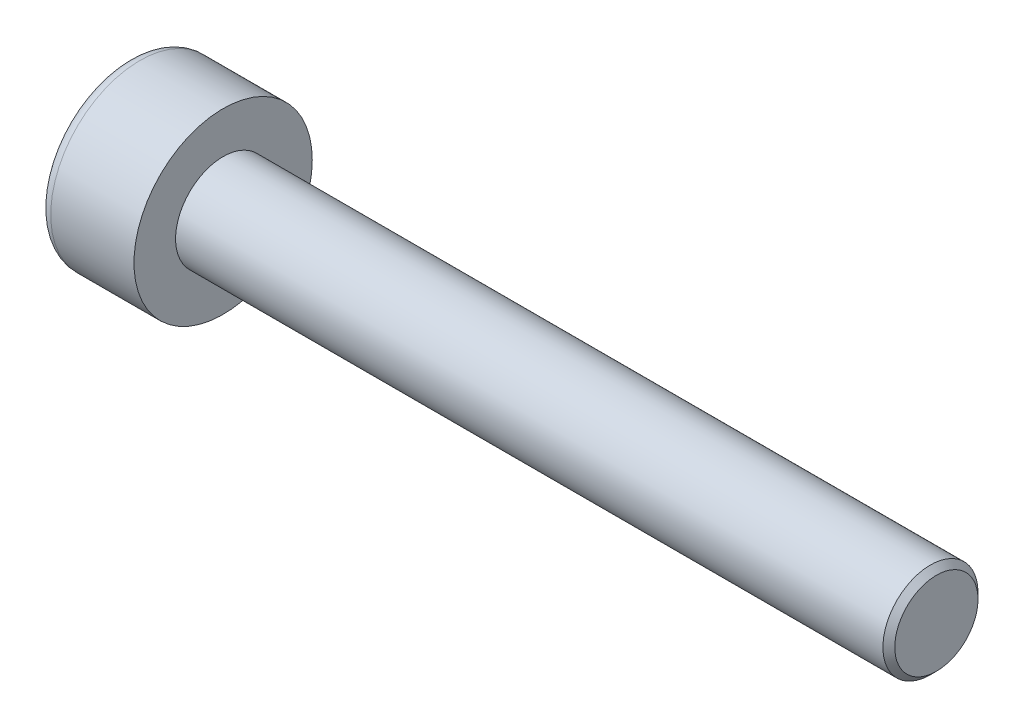
ISO-10303-21;
HEADER;
FILE_DESCRIPTION(('STEP AP214'),'2;1');
FILE_NAME('part.step','',(''),(''),'','','');
FILE_SCHEMA(('AUTOMOTIVE_DESIGN { 1 0 10303 214 1 1 1 1 }'));
ENDSEC;
DATA;
#1=APPLICATION_CONTEXT('core data for automotive mechanical design processes');
#2=APPLICATION_PROTOCOL_DEFINITION('international standard','automotive_design',2000,#1);
#3=PRODUCT_CONTEXT('',#1,'mechanical');
#4=PRODUCT('Part','Part','',(#3));
#5=PRODUCT_RELATED_PRODUCT_CATEGORY('part','',(#4));
#6=PRODUCT_DEFINITION_FORMATION('','',#4);
#7=PRODUCT_DEFINITION_CONTEXT('part definition',#1,'design');
#8=PRODUCT_DEFINITION('design','',#6,#7);
#9=PRODUCT_DEFINITION_SHAPE('','',#8);
#10=(LENGTH_UNIT() NAMED_UNIT(*) SI_UNIT(.MILLI.,.METRE.));
#11=(NAMED_UNIT(*) PLANE_ANGLE_UNIT() SI_UNIT($,.RADIAN.));
#12=(NAMED_UNIT(*) SI_UNIT($,.STERADIAN.) SOLID_ANGLE_UNIT());
#13=UNCERTAINTY_MEASURE_WITH_UNIT(LENGTH_MEASURE(1.E-05),#10,'distance_accuracy_value','');
#14=(GEOMETRIC_REPRESENTATION_CONTEXT(3) GLOBAL_UNCERTAINTY_ASSIGNED_CONTEXT((#13)) GLOBAL_UNIT_ASSIGNED_CONTEXT((#10,
#11,#12)) REPRESENTATION_CONTEXT('',''));
#15=CARTESIAN_POINT('',(0.,0.,0.));
#16=DIRECTION('',(0.,0.,1.));
#17=DIRECTION('',(1.,0.,0.));
#18=AXIS2_PLACEMENT_3D('',#15,#16,#17);
#19=CARTESIAN_POINT('',(0.7,0.,-0.866025403784446));
#20=DIRECTION('',(1.,0.,0.));
#21=DIRECTION('',(0.,0.,-1.));
#22=AXIS2_PLACEMENT_3D('',#19,#20,#21);
#23=PLANE('',#22);
#24=CARTESIAN_POINT('',(0.7,0.,0.));
#25=DIRECTION('',(1.,0.,0.));
#26=DIRECTION('',(0.,0.,-1.));
#27=AXIS2_PLACEMENT_3D('',#24,#25,#26);
#28=CIRCLE('',#27,0.750000000000004);
#29=CARTESIAN_POINT('',(0.7,-0.375000000000009,-0.649519052838328));
#30=VERTEX_POINT('',#29);
#31=CARTESIAN_POINT('',(0.7,-0.750000000000004,0.));
#32=VERTEX_POINT('',#31);
#33=EDGE_CURVE('E160',#30,#32,#28,.F.);
#34=ORIENTED_EDGE('',*,*,#33,.F.);
#35=DIRECTION('',(0.,0.866025403784433,-0.50000000000001));
#36=VECTOR('',#35,1.);
#37=CARTESIAN_POINT('',(0.7,-0.75,-0.43301270189222));
#38=LINE('',#37,#36);
#39=CARTESIAN_POINT('',(0.7,-0.75,-0.43301270189222));
#40=VERTEX_POINT('',#39);
#41=EDGE_CURVE('E168',#40,#30,#38,.T.);
#42=ORIENTED_EDGE('',*,*,#41,.F.);
#43=DIRECTION('',(0.,0.,-1.));
#44=VECTOR('',#43,1.);
#45=CARTESIAN_POINT('',(0.7,-0.750000000000004,0.433012701892211));
#46=LINE('',#45,#44);
#47=EDGE_CURVE('E185',#32,#40,#46,.T.);
#48=ORIENTED_EDGE('',*,*,#47,.F.);
#49=EDGE_LOOP('',(#34,#42,#48));
#50=FACE_BOUND('',#49,.T.);
#51=ADVANCED_FACE('F37',(#50),#23,.F.);
#52=CARTESIAN_POINT('',(0.7,-0.375000000000007,0.64951905283833));
#53=VERTEX_POINT('',#52);
#54=EDGE_CURVE('E290',#32,#53,#28,.F.);
#55=ORIENTED_EDGE('',*,*,#54,.F.);
#56=CARTESIAN_POINT('',(0.7,-0.750000000000004,0.433012701892211));
#57=VERTEX_POINT('',#56);
#58=EDGE_CURVE('E186',#57,#32,#46,.T.);
#59=ORIENTED_EDGE('',*,*,#58,.F.);
#60=DIRECTION('',(0.,-0.866025403784435,-0.500000000000006));
#61=VECTOR('',#60,1.);
#62=CARTESIAN_POINT('',(0.7,0.,0.866025403784436));
#63=LINE('',#62,#61);
#64=EDGE_CURVE('E181',#53,#57,#63,.T.);
#65=ORIENTED_EDGE('',*,*,#64,.F.);
#66=EDGE_LOOP('',(#55,#59,#65));
#67=FACE_BOUND('',#66,.T.);
#68=ADVANCED_FACE('F126',(#67),#23,.F.);
#69=CARTESIAN_POINT('',(0.7,0.374999999999996,0.649519052838336));
#70=VERTEX_POINT('',#69);
#71=EDGE_CURVE('E286',#53,#70,#28,.F.);
#72=ORIENTED_EDGE('',*,*,#71,.F.);
#73=CARTESIAN_POINT('',(0.7,0.,0.866025403784436));
#74=VERTEX_POINT('',#73);
#75=EDGE_CURVE('E182',#74,#53,#63,.T.);
#76=ORIENTED_EDGE('',*,*,#75,.F.);
#77=DIRECTION('',(0.,-0.866025403784443,0.499999999999991));
#78=VECTOR('',#77,1.);
#79=CARTESIAN_POINT('',(0.7,0.749999999999999,0.433012701892223));
#80=LINE('',#79,#78);
#81=EDGE_CURVE('E177',#70,#74,#80,.T.);
#82=ORIENTED_EDGE('',*,*,#81,.F.);
#83=EDGE_LOOP('',(#72,#76,#82));
#84=FACE_BOUND('',#83,.T.);
#85=ADVANCED_FACE('F132',(#84),#23,.F.);
#86=CARTESIAN_POINT('',(0.7,0.750000000000004,0.));
#87=VERTEX_POINT('',#86);
#88=EDGE_CURVE('E157',#70,#87,#28,.F.);
#89=ORIENTED_EDGE('',*,*,#88,.F.);
#90=CARTESIAN_POINT('',(0.7,0.749999999999999,0.433012701892223));
#91=VERTEX_POINT('',#90);
#92=EDGE_CURVE('E178',#91,#70,#80,.T.);
#93=ORIENTED_EDGE('',*,*,#92,.F.);
#94=DIRECTION('',(0.,0.,1.));
#95=VECTOR('',#94,1.);
#96=CARTESIAN_POINT('',(0.7,0.750000000000006,-0.433012701892211));
#97=LINE('',#96,#95);
#98=EDGE_CURVE('E172',#87,#91,#97,.T.);
#99=ORIENTED_EDGE('',*,*,#98,.F.);
#100=EDGE_LOOP('',(#89,#93,#99));
#101=FACE_BOUND('',#100,.T.);
#102=ADVANCED_FACE('F146',(#101),#23,.F.);
#103=CARTESIAN_POINT('',(0.7,0.,0.));
#104=DIRECTION('',(1.,0.,0.));
#105=DIRECTION('',(0.,0.,-1.));
#106=AXIS2_PLACEMENT_3D('',#103,#104,#105);
#107=CIRCLE('',#106,0.750000000000004);
#108=CARTESIAN_POINT('',(0.7,0.375000000000005,-0.649519052838325));
#109=VERTEX_POINT('',#108);
#110=EDGE_CURVE('E52',#109,#87,#107,.T.);
#111=ORIENTED_EDGE('',*,*,#110,.T.);
#112=CARTESIAN_POINT('',(0.7,0.750000000000006,-0.433012701892211));
#113=VERTEX_POINT('',#112);
#114=EDGE_CURVE('E165',#113,#87,#97,.T.);
#115=ORIENTED_EDGE('',*,*,#114,.F.);
#116=DIRECTION('',(0.,0.866025403784434,0.500000000000008));
#117=VECTOR('',#116,1.);
#118=CARTESIAN_POINT('',(0.7,0.,-0.866025403784446));
#119=LINE('',#118,#117);
#120=EDGE_CURVE('E162',#109,#113,#119,.T.);
#121=ORIENTED_EDGE('',*,*,#120,.F.);
#122=EDGE_LOOP('',(#111,#115,#121));
#123=FACE_BOUND('',#122,.T.);
#124=ADVANCED_FACE('F137',(#123),#23,.F.);
#125=EDGE_CURVE('E150',#109,#30,#28,.F.);
#126=ORIENTED_EDGE('',*,*,#125,.F.);
#127=CARTESIAN_POINT('',(0.7,0.,-0.866025403784446));
#128=VERTEX_POINT('',#127);
#129=EDGE_CURVE('E153',#128,#109,#119,.T.);
#130=ORIENTED_EDGE('',*,*,#129,.F.);
#131=EDGE_CURVE('E155',#30,#128,#38,.T.);
#132=ORIENTED_EDGE('',*,*,#131,.F.);
#133=EDGE_LOOP('',(#126,#130,#132));
#134=FACE_BOUND('',#133,.T.);
#135=ADVANCED_FACE('F128',(#134),#23,.F.);
#136=CARTESIAN_POINT('',(0.,0.,0.));
#137=DIRECTION('',(1.,0.,0.));
#138=DIRECTION('',(0.,0.,-1.));
#139=AXIS2_PLACEMENT_3D('',#136,#137,#138);
#140=PLANE('',#139);
#141=CARTESIAN_POINT('',(0.,0.,0.));
#142=DIRECTION('',(1.,0.,0.));
#143=DIRECTION('',(0.,0.,-1.));
#144=AXIS2_PLACEMENT_3D('',#141,#142,#143);
#145=CIRCLE('',#144,1.3);
#146=CARTESIAN_POINT('',(0.,0.,-1.3));
#147=VERTEX_POINT('',#146);
#148=EDGE_CURVE('E225',#147,#147,#145,.F.);
#149=ORIENTED_EDGE('',*,*,#148,.T.);
#150=EDGE_LOOP('',(#149));
#151=FACE_BOUND('',#150,.T.);
#152=DIRECTION('',(0.,0.866025403784433,-0.50000000000001));
#153=VECTOR('',#152,1.);
#154=CARTESIAN_POINT('',(0.,-0.75,-0.43301270189222));
#155=LINE('',#154,#153);
#156=CARTESIAN_POINT('',(0.,-0.75,-0.43301270189222));
#157=VERTEX_POINT('',#156);
#158=CARTESIAN_POINT('',(0.,0.,-0.866025403784446));
#159=VERTEX_POINT('',#158);
#160=EDGE_CURVE('E60',#157,#159,#155,.T.);
#161=ORIENTED_EDGE('',*,*,#160,.T.);
#162=DIRECTION('',(0.,0.866025403784434,0.500000000000008));
#163=VECTOR('',#162,1.);
#164=CARTESIAN_POINT('',(0.,0.,-0.866025403784446));
#165=LINE('',#164,#163);
#166=CARTESIAN_POINT('',(0.,0.750000000000006,-0.433012701892211));
#167=VERTEX_POINT('',#166);
#168=EDGE_CURVE('E191',#159,#167,#165,.T.);
#169=ORIENTED_EDGE('',*,*,#168,.T.);
#170=DIRECTION('',(0.,0.,1.));
#171=VECTOR('',#170,1.);
#172=CARTESIAN_POINT('',(0.,0.750000000000006,-0.433012701892211));
#173=LINE('',#172,#171);
#174=CARTESIAN_POINT('',(0.,0.749999999999999,0.433012701892223));
#175=VERTEX_POINT('',#174);
#176=EDGE_CURVE('E194',#167,#175,#173,.T.);
#177=ORIENTED_EDGE('',*,*,#176,.T.);
#178=DIRECTION('',(0.,-0.866025403784443,0.499999999999991));
#179=VECTOR('',#178,1.);
#180=CARTESIAN_POINT('',(0.,0.749999999999999,0.433012701892223));
#181=LINE('',#180,#179);
#182=CARTESIAN_POINT('',(0.,0.,0.866025403784436));
#183=VERTEX_POINT('',#182);
#184=EDGE_CURVE('E197',#175,#183,#181,.T.);
#185=ORIENTED_EDGE('',*,*,#184,.T.);
#186=DIRECTION('',(0.,-0.866025403784435,-0.500000000000006));
#187=VECTOR('',#186,1.);
#188=CARTESIAN_POINT('',(0.,0.,0.866025403784436));
#189=LINE('',#188,#187);
#190=CARTESIAN_POINT('',(0.,-0.750000000000004,0.433012701892211));
#191=VERTEX_POINT('',#190);
#192=EDGE_CURVE('E200',#183,#191,#189,.T.);
#193=ORIENTED_EDGE('',*,*,#192,.T.);
#194=DIRECTION('',(0.,0.,-1.));
#195=VECTOR('',#194,1.);
#196=CARTESIAN_POINT('',(0.,-0.750000000000004,0.433012701892211));
#197=LINE('',#196,#195);
#198=EDGE_CURVE('E203',#191,#157,#197,.T.);
#199=ORIENTED_EDGE('',*,*,#198,.T.);
#200=EDGE_LOOP('',(#161,#169,#177,#185,#193,#199));
#201=FACE_BOUND('',#200,.T.);
#202=ADVANCED_FACE('F136',(#151,#201),#140,.F.);
#203=CARTESIAN_POINT('',(1.6,0.,0.));
#204=DIRECTION('',(1.,0.,0.));
#205=DIRECTION('',(0.,0.,-1.));
#206=AXIS2_PLACEMENT_3D('',#203,#204,#205);
#207=PLANE('',#206);
#208=CARTESIAN_POINT('',(1.6,0.,0.));
#209=DIRECTION('',(1.,0.,0.));
#210=DIRECTION('',(0.,0.,-1.));
#211=AXIS2_PLACEMENT_3D('',#208,#209,#210);
#212=CIRCLE('',#211,1.5);
#213=CARTESIAN_POINT('',(1.6,0.,-1.5));
#214=VERTEX_POINT('',#213);
#215=EDGE_CURVE('E158',#214,#214,#212,.T.);
#216=ORIENTED_EDGE('',*,*,#215,.T.);
#217=EDGE_LOOP('',(#216));
#218=FACE_BOUND('',#217,.T.);
#219=CARTESIAN_POINT('',(1.6,0.,0.));
#220=DIRECTION('',(1.,0.,0.));
#221=DIRECTION('',(0.,0.,-1.));
#222=AXIS2_PLACEMENT_3D('',#219,#220,#221);
#223=CIRCLE('',#222,0.8);
#224=CARTESIAN_POINT('',(1.6,0.,-0.8));
#225=VERTEX_POINT('',#224);
#226=EDGE_CURVE('E216',#225,#225,#223,.T.);
#227=ORIENTED_EDGE('',*,*,#226,.F.);
#228=EDGE_LOOP('',(#227));
#229=FACE_BOUND('',#228,.T.);
#230=ADVANCED_FACE('F143',(#218,#229),#207,.T.);
#231=CARTESIAN_POINT('',(1.6,0.,0.));
#232=DIRECTION('',(-1.,0.,0.));
#233=DIRECTION('',(0.,0.,1.));
#234=AXIS2_PLACEMENT_3D('',#231,#232,#233);
#235=CYLINDRICAL_SURFACE('',#234,1.5);
#236=CARTESIAN_POINT('',(0.2,0.,0.));
#237=DIRECTION('',(1.,0.,0.));
#238=DIRECTION('',(0.,0.,-1.));
#239=AXIS2_PLACEMENT_3D('',#236,#237,#238);
#240=CIRCLE('',#239,1.5);
#241=CARTESIAN_POINT('',(0.2,0.,-1.5));
#242=VERTEX_POINT('',#241);
#243=EDGE_CURVE('E222',#242,#242,#240,.T.);
#244=ORIENTED_EDGE('',*,*,#243,.T.);
#245=EDGE_LOOP('',(#244));
#246=FACE_BOUND('',#245,.T.);
#247=ORIENTED_EDGE('',*,*,#215,.F.);
#248=EDGE_LOOP('',(#247));
#249=FACE_BOUND('',#248,.T.);
#250=ADVANCED_FACE('F241',(#246,#249),#235,.T.);
#251=CARTESIAN_POINT('',(13.6,0.,0.));
#252=DIRECTION('',(-1.,0.,0.));
#253=DIRECTION('',(0.,0.,1.));
#254=AXIS2_PLACEMENT_3D('',#251,#252,#253);
#255=CYLINDRICAL_SURFACE('',#254,0.8);
#256=CARTESIAN_POINT('',(13.5,0.,0.));
#257=DIRECTION('',(1.,0.,0.));
#258=DIRECTION('',(0.,0.,-1.));
#259=AXIS2_PLACEMENT_3D('',#256,#257,#258);
#260=CIRCLE('',#259,0.8);
#261=CARTESIAN_POINT('',(13.5,0.,-0.8));
#262=VERTEX_POINT('',#261);
#263=EDGE_CURVE('E11',#262,#262,#260,.F.);
#264=ORIENTED_EDGE('',*,*,#263,.T.);
#265=EDGE_LOOP('',(#264));
#266=FACE_BOUND('',#265,.T.);
#267=ORIENTED_EDGE('',*,*,#226,.T.);
#268=EDGE_LOOP('',(#267));
#269=FACE_BOUND('',#268,.T.);
#270=ADVANCED_FACE('F238',(#266,#269),#255,.T.);
#271=CARTESIAN_POINT('',(13.6,0.,0.));
#272=DIRECTION('',(1.,0.,0.));
#273=DIRECTION('',(0.,0.,-1.));
#274=AXIS2_PLACEMENT_3D('',#271,#272,#273);
#275=PLANE('',#274);
#276=CARTESIAN_POINT('',(13.6,0.,0.));
#277=DIRECTION('',(1.,0.,0.));
#278=DIRECTION('',(0.,0.,-1.));
#279=AXIS2_PLACEMENT_3D('',#276,#277,#278);
#280=CIRCLE('',#279,0.700000000000001);
#281=CARTESIAN_POINT('',(13.6,0.,-0.700000000000001));
#282=VERTEX_POINT('',#281);
#283=EDGE_CURVE('E45',#282,#282,#280,.T.);
#284=ORIENTED_EDGE('',*,*,#283,.T.);
#285=EDGE_LOOP('',(#284));
#286=FACE_BOUND('',#285,.T.);
#287=ADVANCED_FACE('F230',(#286),#275,.T.);
#288=CARTESIAN_POINT('',(0.7,-0.75,-0.43301270189222));
#289=DIRECTION('',(0.,0.50000000000001,0.866025403784433));
#290=DIRECTION('',(0.,-0.866025403784433,0.50000000000001));
#291=AXIS2_PLACEMENT_3D('',#288,#289,#290);
#292=PLANE('',#291);
#293=ORIENTED_EDGE('',*,*,#160,.F.);
#294=DIRECTION('',(-1.,0.,0.));
#295=VECTOR('',#294,1.);
#296=CARTESIAN_POINT('',(0.7,-0.75,-0.43301270189222));
#297=LINE('',#296,#295);
#298=EDGE_CURVE('E189',#40,#157,#297,.T.);
#299=ORIENTED_EDGE('',*,*,#298,.F.);
#300=ORIENTED_EDGE('',*,*,#41,.T.);
#301=ORIENTED_EDGE('',*,*,#131,.T.);
#302=DIRECTION('',(-1.,0.,0.));
#303=VECTOR('',#302,1.);
#304=CARTESIAN_POINT('',(0.7,0.,-0.866025403784446));
#305=LINE('',#304,#303);
#306=EDGE_CURVE('E171',#128,#159,#305,.T.);
#307=ORIENTED_EDGE('',*,*,#306,.T.);
#308=EDGE_LOOP('',(#293,#299,#300,#301,#307));
#309=FACE_BOUND('',#308,.T.);
#310=ADVANCED_FACE('F256',(#309),#292,.T.);
#311=CARTESIAN_POINT('',(0.7,0.,-0.866025403784446));
#312=DIRECTION('',(0.,-0.500000000000008,0.866025403784434));
#313=DIRECTION('',(0.,-0.866025403784434,-0.500000000000008));
#314=AXIS2_PLACEMENT_3D('',#311,#312,#313);
#315=PLANE('',#314);
#316=ORIENTED_EDGE('',*,*,#168,.F.);
#317=ORIENTED_EDGE('',*,*,#306,.F.);
#318=ORIENTED_EDGE('',*,*,#129,.T.);
#319=ORIENTED_EDGE('',*,*,#120,.T.);
#320=DIRECTION('',(-1.,0.,0.));
#321=VECTOR('',#320,1.);
#322=CARTESIAN_POINT('',(0.7,0.750000000000006,-0.433012701892211));
#323=LINE('',#322,#321);
#324=EDGE_CURVE('E213',#113,#167,#323,.T.);
#325=ORIENTED_EDGE('',*,*,#324,.T.);
#326=EDGE_LOOP('',(#316,#317,#318,#319,#325));
#327=FACE_BOUND('',#326,.T.);
#328=ADVANCED_FACE('F170',(#327),#315,.T.);
#329=CARTESIAN_POINT('',(0.7,0.750000000000006,-0.433012701892211));
#330=DIRECTION('',(0.,-1.,0.));
#331=DIRECTION('',(0.,0.,-1.));
#332=AXIS2_PLACEMENT_3D('',#329,#330,#331);
#333=PLANE('',#332);
#334=ORIENTED_EDGE('',*,*,#176,.F.);
#335=ORIENTED_EDGE('',*,*,#324,.F.);
#336=ORIENTED_EDGE('',*,*,#114,.T.);
#337=ORIENTED_EDGE('',*,*,#98,.T.);
#338=DIRECTION('',(-1.,0.,0.));
#339=VECTOR('',#338,1.);
#340=CARTESIAN_POINT('',(0.7,0.749999999999999,0.433012701892223));
#341=LINE('',#340,#339);
#342=EDGE_CURVE('E211',#91,#175,#341,.T.);
#343=ORIENTED_EDGE('',*,*,#342,.T.);
#344=EDGE_LOOP('',(#334,#335,#336,#337,#343));
#345=FACE_BOUND('',#344,.T.);
#346=ADVANCED_FACE('F261',(#345),#333,.T.);
#347=CARTESIAN_POINT('',(0.7,0.749999999999999,0.433012701892223));
#348=DIRECTION('',(0.,-0.499999999999992,-0.866025403784444));
#349=DIRECTION('',(0.,0.866025403784444,-0.499999999999992));
#350=AXIS2_PLACEMENT_3D('',#347,#348,#349);
#351=PLANE('',#350);
#352=ORIENTED_EDGE('',*,*,#184,.F.);
#353=ORIENTED_EDGE('',*,*,#342,.F.);
#354=ORIENTED_EDGE('',*,*,#92,.T.);
#355=ORIENTED_EDGE('',*,*,#81,.T.);
#356=DIRECTION('',(-1.,0.,0.));
#357=VECTOR('',#356,1.);
#358=CARTESIAN_POINT('',(0.7,0.,0.866025403784436));
#359=LINE('',#358,#357);
#360=EDGE_CURVE('E209',#74,#183,#359,.T.);
#361=ORIENTED_EDGE('',*,*,#360,.T.);
#362=EDGE_LOOP('',(#352,#353,#354,#355,#361));
#363=FACE_BOUND('',#362,.T.);
#364=ADVANCED_FACE('F264',(#363),#351,.T.);
#365=CARTESIAN_POINT('',(0.7,0.,0.866025403784436));
#366=DIRECTION('',(0.,0.500000000000006,-0.866025403784435));
#367=DIRECTION('',(0.,0.866025403784435,0.500000000000006));
#368=AXIS2_PLACEMENT_3D('',#365,#366,#367);
#369=PLANE('',#368);
#370=ORIENTED_EDGE('',*,*,#192,.F.);
#371=ORIENTED_EDGE('',*,*,#360,.F.);
#372=ORIENTED_EDGE('',*,*,#75,.T.);
#373=ORIENTED_EDGE('',*,*,#64,.T.);
#374=DIRECTION('',(-1.,0.,0.));
#375=VECTOR('',#374,1.);
#376=CARTESIAN_POINT('',(0.7,-0.750000000000004,0.433012701892211));
#377=LINE('',#376,#375);
#378=EDGE_CURVE('E207',#57,#191,#377,.T.);
#379=ORIENTED_EDGE('',*,*,#378,.T.);
#380=EDGE_LOOP('',(#370,#371,#372,#373,#379));
#381=FACE_BOUND('',#380,.T.);
#382=ADVANCED_FACE('F121',(#381),#369,.T.);
#383=CARTESIAN_POINT('',(0.7,-0.750000000000004,0.433012701892211));
#384=DIRECTION('',(0.,1.,0.));
#385=DIRECTION('',(0.,0.,1.));
#386=AXIS2_PLACEMENT_3D('',#383,#384,#385);
#387=PLANE('',#386);
#388=ORIENTED_EDGE('',*,*,#198,.F.);
#389=ORIENTED_EDGE('',*,*,#378,.F.);
#390=ORIENTED_EDGE('',*,*,#58,.T.);
#391=ORIENTED_EDGE('',*,*,#47,.T.);
#392=ORIENTED_EDGE('',*,*,#298,.T.);
#393=EDGE_LOOP('',(#388,#389,#390,#391,#392));
#394=FACE_BOUND('',#393,.T.);
#395=ADVANCED_FACE('F114',(#394),#387,.T.);
#396=CARTESIAN_POINT('',(0.7,0.,0.));
#397=DIRECTION('',(-1.,0.,0.));
#398=DIRECTION('',(0.,0.,1.));
#399=AXIS2_PLACEMENT_3D('',#396,#397,#398);
#400=CONICAL_SURFACE('',#399,0.750000000000004,1.04719755119659);
#401=CARTESIAN_POINT('',(1.13301270189223,0.,0.));
#402=VERTEX_POINT('',#401);
#403=VERTEX_LOOP('',#402);
#404=FACE_BOUND('',#403,.T.);
#405=ORIENTED_EDGE('',*,*,#110,.F.);
#406=ORIENTED_EDGE('',*,*,#125,.T.);
#407=ORIENTED_EDGE('',*,*,#33,.T.);
#408=ORIENTED_EDGE('',*,*,#54,.T.);
#409=ORIENTED_EDGE('',*,*,#71,.T.);
#410=ORIENTED_EDGE('',*,*,#88,.T.);
#411=EDGE_LOOP('',(#405,#406,#407,#408,#409,#410));
#412=FACE_BOUND('',#411,.T.);
#413=ADVANCED_FACE('F111',(#404,#412),#400,.F.);
#414=CARTESIAN_POINT('',(0.2,0.,0.));
#415=DIRECTION('',(1.,0.,0.));
#416=DIRECTION('',(0.,0.,-1.));
#417=AXIS2_PLACEMENT_3D('',#414,#415,#416);
#418=TOROIDAL_SURFACE('',#417,1.3,0.2);
#419=ORIENTED_EDGE('',*,*,#148,.F.);
#420=EDGE_LOOP('',(#419));
#421=FACE_BOUND('',#420,.T.);
#422=ORIENTED_EDGE('',*,*,#243,.F.);
#423=EDGE_LOOP('',(#422));
#424=FACE_BOUND('',#423,.T.);
#425=ADVANCED_FACE('F113',(#421,#424),#418,.T.);
#426=CARTESIAN_POINT('',(13.6,0.,0.));
#427=DIRECTION('',(-1.,0.,0.));
#428=DIRECTION('',(0.,0.,1.));
#429=AXIS2_PLACEMENT_3D('',#426,#427,#428);
#430=CONICAL_SURFACE('',#429,0.700000000000001,0.785398163397455);
#431=ORIENTED_EDGE('',*,*,#263,.F.);
#432=EDGE_LOOP('',(#431));
#433=FACE_BOUND('',#432,.T.);
#434=ORIENTED_EDGE('',*,*,#283,.F.);
#435=EDGE_LOOP('',(#434));
#436=FACE_BOUND('',#435,.T.);
#437=ADVANCED_FACE('F39',(#433,#436),#430,.T.);
#438=CLOSED_SHELL('',(#51,#68,#85,#102,#124,#135,#202,#230,#250,#270,#287,#310,#328,#346,#364,
#382,#395,#413,#425,#437));
#439=MANIFOLD_SOLID_BREP('B2',#438);
#440=ADVANCED_BREP_SHAPE_REPRESENTATION('',(#18,#439),#14);
#441=SHAPE_DEFINITION_REPRESENTATION(#9,#440);
ENDSEC;
END-ISO-10303-21;
